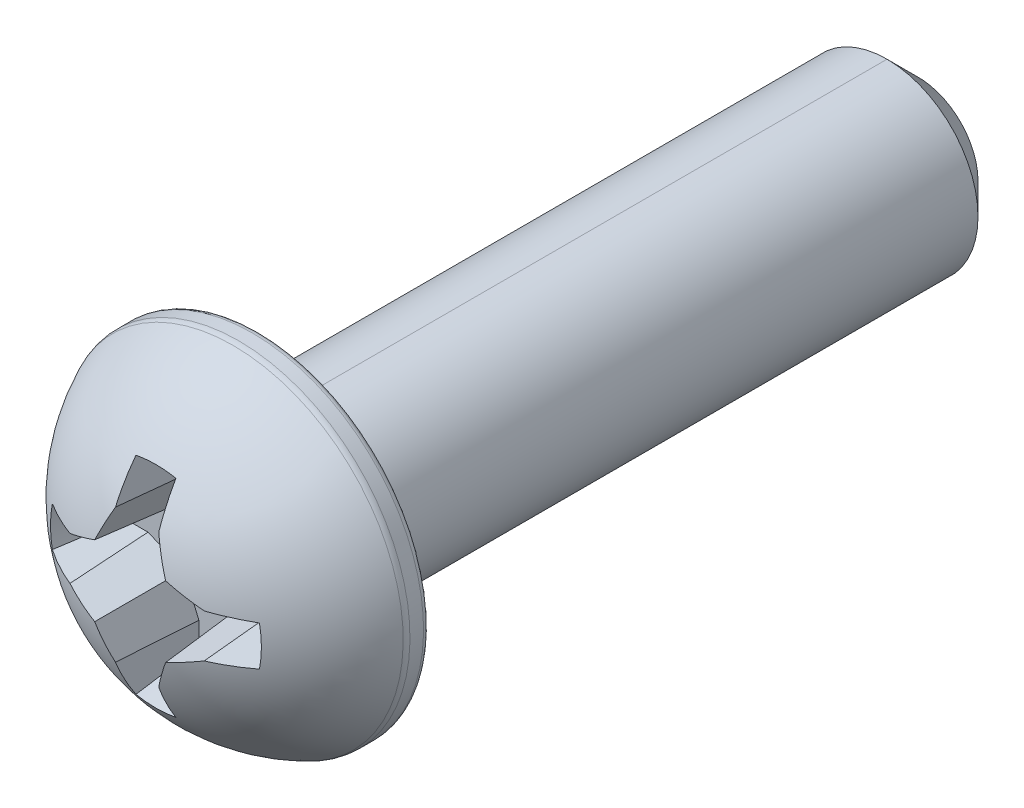
ISO-10303-21;
HEADER;
FILE_DESCRIPTION(('STEP AP214'),'2;1');
FILE_NAME('part.step','',(''),(''),'','','');
FILE_SCHEMA(('AUTOMOTIVE_DESIGN { 1 0 10303 214 1 1 1 1 }'));
ENDSEC;
DATA;
#1=APPLICATION_CONTEXT('core data for automotive mechanical design processes');
#2=APPLICATION_PROTOCOL_DEFINITION('international standard','automotive_design',2000,#1);
#3=PRODUCT_CONTEXT('',#1,'mechanical');
#4=PRODUCT('Part','Part','',(#3));
#5=PRODUCT_RELATED_PRODUCT_CATEGORY('part','',(#4));
#6=PRODUCT_DEFINITION_FORMATION('','',#4);
#7=PRODUCT_DEFINITION_CONTEXT('part definition',#1,'design');
#8=PRODUCT_DEFINITION('design','',#6,#7);
#9=PRODUCT_DEFINITION_SHAPE('','',#8);
#10=(LENGTH_UNIT() NAMED_UNIT(*) SI_UNIT(.MILLI.,.METRE.));
#11=(NAMED_UNIT(*) PLANE_ANGLE_UNIT() SI_UNIT($,.RADIAN.));
#12=(NAMED_UNIT(*) SI_UNIT($,.STERADIAN.) SOLID_ANGLE_UNIT());
#13=UNCERTAINTY_MEASURE_WITH_UNIT(LENGTH_MEASURE(1.E-05),#10,'distance_accuracy_value','');
#14=(GEOMETRIC_REPRESENTATION_CONTEXT(3) GLOBAL_UNCERTAINTY_ASSIGNED_CONTEXT((#13)) GLOBAL_UNIT_ASSIGNED_CONTEXT((#10,
#11,#12)) REPRESENTATION_CONTEXT('',''));
#15=CARTESIAN_POINT('',(0.,0.,0.));
#16=DIRECTION('',(0.,0.,1.));
#17=DIRECTION('',(1.,0.,0.));
#18=AXIS2_PLACEMENT_3D('',#15,#16,#17);
#19=CARTESIAN_POINT('',(0.,0.,0.));
#20=DIRECTION('',(0.,0.,1.));
#21=DIRECTION('',(1.,0.,0.));
#22=AXIS2_PLACEMENT_3D('',#19,#20,#21);
#23=PLANE('',#22);
#24=CARTESIAN_POINT('',(0.,0.,0.));
#25=DIRECTION('',(0.,0.,-1.));
#26=DIRECTION('',(0.,1.,0.));
#27=AXIS2_PLACEMENT_3D('',#24,#25,#26);
#28=CIRCLE('',#27,3.17119);
#29=CARTESIAN_POINT('',(0.,3.17119,0.));
#30=VERTEX_POINT('',#29);
#31=EDGE_CURVE('E446',#30,#30,#28,.T.);
#32=ORIENTED_EDGE('',*,*,#31,.T.);
#33=EDGE_LOOP('',(#32));
#34=FACE_BOUND('',#33,.T.);
#35=CARTESIAN_POINT('',(0.,0.,0.));
#36=DIRECTION('',(0.,0.,1.));
#37=DIRECTION('',(1.,0.,0.));
#38=AXIS2_PLACEMENT_3D('',#35,#36,#37);
#39=CIRCLE('',#38,1.75259999999999);
#40=CARTESIAN_POINT('',(0.,1.7526,0.));
#41=VERTEX_POINT('',#40);
#42=CARTESIAN_POINT('',(0.,-1.75259999999999,0.));
#43=VERTEX_POINT('',#42);
#44=EDGE_CURVE('E463',#41,#43,#39,.T.);
#45=ORIENTED_EDGE('',*,*,#44,.T.);
#46=EDGE_CURVE('E57',#43,#41,#39,.T.);
#47=ORIENTED_EDGE('',*,*,#46,.T.);
#48=EDGE_LOOP('',(#45,#47));
#49=FACE_BOUND('',#48,.T.);
#50=ADVANCED_FACE('F39',(#34,#49),#23,.F.);
#51=CARTESIAN_POINT('',(0.,0.,2.6162));
#52=DIRECTION('',(0.,0.,-1.));
#53=DIRECTION('',(-1.,0.,0.));
#54=AXIS2_PLACEMENT_3D('',#51,#52,#53);
#55=CYLINDRICAL_SURFACE('',#54,3.302);
#56=CARTESIAN_POINT('',(0.,0.,0.392429999999998));
#57=DIRECTION('',(0.,0.,-1.));
#58=DIRECTION('',(0.,1.,0.));
#59=AXIS2_PLACEMENT_3D('',#56,#57,#58);
#60=CIRCLE('',#59,3.302);
#61=CARTESIAN_POINT('',(0.,3.302,0.392429999999998));
#62=VERTEX_POINT('',#61);
#63=EDGE_CURVE('E434',#62,#62,#60,.T.);
#64=ORIENTED_EDGE('',*,*,#63,.T.);
#65=EDGE_LOOP('',(#64));
#66=FACE_BOUND('',#65,.T.);
#67=CARTESIAN_POINT('',(0.,0.,0.130809999999998));
#68=DIRECTION('',(0.,0.,-1.));
#69=DIRECTION('',(0.,1.,0.));
#70=AXIS2_PLACEMENT_3D('',#67,#68,#69);
#71=CIRCLE('',#70,3.302);
#72=CARTESIAN_POINT('',(0.,3.302,0.130809999999998));
#73=VERTEX_POINT('',#72);
#74=EDGE_CURVE('E432',#73,#73,#71,.T.);
#75=ORIENTED_EDGE('',*,*,#74,.F.);
#76=EDGE_LOOP('',(#75));
#77=FACE_BOUND('',#76,.T.);
#78=ADVANCED_FACE('F295',(#66,#77),#55,.T.);
#79=CARTESIAN_POINT('',(0.,0.,0.130809999999998));
#80=DIRECTION('',(0.,0.,-1.));
#81=DIRECTION('',(0.,1.,0.));
#82=AXIS2_PLACEMENT_3D('',#79,#80,#81);
#83=TOROIDAL_SURFACE('',#82,3.17119,0.13081);
#84=ORIENTED_EDGE('',*,*,#31,.F.);
#85=EDGE_LOOP('',(#84));
#86=FACE_BOUND('',#85,.T.);
#87=ORIENTED_EDGE('',*,*,#74,.T.);
#88=EDGE_LOOP('',(#87));
#89=FACE_BOUND('',#88,.T.);
#90=ADVANCED_FACE('F495',(#86,#89),#83,.T.);
#91=CARTESIAN_POINT('',(0.,0.,0.392429999999998));
#92=DIRECTION('',(0.,0.,-1.));
#93=DIRECTION('',(0.,1.,0.));
#94=AXIS2_PLACEMENT_3D('',#91,#92,#93);
#95=TOROIDAL_SURFACE('',#94,3.04038,0.261620000000001);
#96=ORIENTED_EDGE('',*,*,#63,.F.);
#97=EDGE_LOOP('',(#96));
#98=FACE_BOUND('',#97,.T.);
#99=CARTESIAN_POINT('',(0.,0.,0.50020092308562));
#100=DIRECTION('',(0.,0.,-1.));
#101=DIRECTION('',(0.,1.,0.));
#102=AXIS2_PLACEMENT_3D('',#99,#100,#101);
#103=CIRCLE('',#102,3.27877138519937);
#104=CARTESIAN_POINT('',(0.,3.27877138519937,0.50020092308562));
#105=VERTEX_POINT('',#104);
#106=EDGE_CURVE('E443',#105,#105,#103,.T.);
#107=ORIENTED_EDGE('',*,*,#106,.T.);
#108=EDGE_LOOP('',(#107));
#109=FACE_BOUND('',#108,.T.);
#110=ADVANCED_FACE('F486',(#98,#109),#95,.T.);
#111=CARTESIAN_POINT('',(0.,0.,-0.982051543689317));
#112=DIRECTION('',(0.,0.,-1.));
#113=DIRECTION('',(0.,1.,0.));
#114=AXIS2_PLACEMENT_3D('',#111,#112,#113);
#115=SPHERICAL_SURFACE('',#114,3.59825154368932);
#116=CARTESIAN_POINT('',(-0.124507435021984,0.,-0.992944532778432));
#117=DIRECTION('',(0.996194698091746,0.,0.0871557427476584));
#118=DIRECTION('',(0.0871557427476584,0.,-0.996194698091746));
#119=AXIS2_PLACEMENT_3D('',#116,#117,#118);
#120=CIRCLE('',#119,3.59608028457034);
#121=CARTESIAN_POINT('',(-0.41693491197537,1.2939210428619,2.34951682356323));
#122=VERTEX_POINT('',#121);
#123=CARTESIAN_POINT('',(-0.385220248810734,1.99590934126789,1.98701656482694));
#124=VERTEX_POINT('',#123);
#125=EDGE_CURVE('E11',#122,#124,#120,.F.);
#126=ORIENTED_EDGE('',*,*,#125,.T.);
#127=CARTESIAN_POINT('',(0.,0.,1.98701656482694));
#128=DIRECTION('',(0.,0.,-1.));
#129=DIRECTION('',(-1.,0.,0.));
#130=AXIS2_PLACEMENT_3D('',#127,#128,#129);
#131=CIRCLE('',#130,2.03274413998767);
#132=CARTESIAN_POINT('',(0.385220248810726,1.99590934126789,1.98701656482694));
#133=VERTEX_POINT('',#132);
#134=EDGE_CURVE('E425',#124,#133,#131,.T.);
#135=ORIENTED_EDGE('',*,*,#134,.T.);
#136=CARTESIAN_POINT('',(0.124507435021985,0.,-0.992944532778432));
#137=DIRECTION('',(-0.996194698091746,0.,0.0871557427476584));
#138=DIRECTION('',(0.0871557427476584,0.,0.996194698091746));
#139=AXIS2_PLACEMENT_3D('',#136,#137,#138);
#140=CIRCLE('',#139,3.59608028457034);
#141=CARTESIAN_POINT('',(0.416934911975365,1.29392104286191,2.34951682356323));
#142=VERTEX_POINT('',#141);
#143=EDGE_CURVE('E422',#133,#142,#140,.F.);
#144=ORIENTED_EDGE('',*,*,#143,.T.);
#145=CARTESIAN_POINT('',(0.539926348171825,0.223644816095348,-1.03318097446649));
#146=DIRECTION('',(-0.920363891963224,-0.381227206369654,0.0871557427476584));
#147=DIRECTION('',(0.38268343236509,-0.923879532511287,0.));
#148=AXIS2_PLACEMENT_3D('',#145,#146,#147);
#149=CIRCLE('',#148,3.55010739101713);
#150=CARTESIAN_POINT('',(0.682817061622561,0.682817061622561,2.48420521142517));
#151=VERTEX_POINT('',#150);
#152=EDGE_CURVE('E426',#142,#151,#149,.F.);
#153=ORIENTED_EDGE('',*,*,#152,.T.);
#154=CARTESIAN_POINT('',(0.223644816095348,0.539926348171825,-1.03318097446649));
#155=DIRECTION('',(-0.381227206369654,-0.920363891963224,0.0871557427476584));
#156=DIRECTION('',(0.923879532511287,-0.38268343236509,0.));
#157=AXIS2_PLACEMENT_3D('',#154,#155,#156);
#158=CIRCLE('',#157,3.55010739101713);
#159=CARTESIAN_POINT('',(1.29392104286191,0.416934911975365,2.34951682356323));
#160=VERTEX_POINT('',#159);
#161=EDGE_CURVE('E428',#151,#160,#158,.F.);
#162=ORIENTED_EDGE('',*,*,#161,.T.);
#163=CARTESIAN_POINT('',(0.,0.124507435021984,-0.992944532778432));
#164=DIRECTION('',(0.,-0.996194698091746,0.0871557427476584));
#165=DIRECTION('',(0.,-0.0871557427476584,-0.996194698091746));
#166=AXIS2_PLACEMENT_3D('',#163,#164,#165);
#167=CIRCLE('',#166,3.59608028457034);
#168=CARTESIAN_POINT('',(1.99590934126789,0.385220248810727,1.98701656482694));
#169=VERTEX_POINT('',#168);
#170=EDGE_CURVE('E329',#160,#169,#167,.F.);
#171=ORIENTED_EDGE('',*,*,#170,.T.);
#172=CARTESIAN_POINT('',(0.,0.,1.98701656482694));
#173=DIRECTION('',(0.,0.,-1.));
#174=DIRECTION('',(-1.,0.,0.));
#175=AXIS2_PLACEMENT_3D('',#172,#173,#174);
#176=CIRCLE('',#175,2.03274413998767);
#177=CARTESIAN_POINT('',(1.99590934126789,-0.385220248810705,1.98701656482694));
#178=VERTEX_POINT('',#177);
#179=EDGE_CURVE('E431',#169,#178,#176,.T.);
#180=ORIENTED_EDGE('',*,*,#179,.T.);
#181=CARTESIAN_POINT('',(0.,-0.124507435021986,-0.992944532778432));
#182=DIRECTION('',(0.,0.996194698091746,0.0871557427476584));
#183=DIRECTION('',(0.,-0.0871557427476584,0.996194698091746));
#184=AXIS2_PLACEMENT_3D('',#181,#182,#183);
#185=CIRCLE('',#184,3.59608028457034);
#186=CARTESIAN_POINT('',(1.29392104286191,-0.416934911975352,2.34951682356323));
#187=VERTEX_POINT('',#186);
#188=EDGE_CURVE('E206',#178,#187,#185,.F.);
#189=ORIENTED_EDGE('',*,*,#188,.T.);
#190=CARTESIAN_POINT('',(0.223644816095354,-0.539926348171823,-1.03318097446649));
#191=DIRECTION('',(-0.381227206369664,0.92036389196322,0.0871557427476584));
#192=DIRECTION('',(-0.923879532511283,-0.3826834323651,0.));
#193=AXIS2_PLACEMENT_3D('',#190,#191,#192);
#194=CIRCLE('',#193,3.55010739101713);
#195=CARTESIAN_POINT('',(0.682817061622568,-0.682817061622554,2.48420521142517));
#196=VERTEX_POINT('',#195);
#197=EDGE_CURVE('E402',#187,#196,#194,.F.);
#198=ORIENTED_EDGE('',*,*,#197,.T.);
#199=CARTESIAN_POINT('',(0.539926348171828,-0.223644816095342,-1.03318097446649));
#200=DIRECTION('',(-0.920363891963228,0.381227206369645,0.0871557427476584));
#201=DIRECTION('',(-0.382683432365081,-0.923879532511291,0.));
#202=AXIS2_PLACEMENT_3D('',#199,#200,#201);
#203=CIRCLE('',#202,3.55010739101713);
#204=CARTESIAN_POINT('',(0.416934911975379,-1.2939210428619,2.34951682356323));
#205=VERTEX_POINT('',#204);
#206=EDGE_CURVE('E563',#196,#205,#203,.F.);
#207=ORIENTED_EDGE('',*,*,#206,.T.);
#208=CARTESIAN_POINT('',(0.124507435021984,0.,-0.992944532778432));
#209=DIRECTION('',(-0.996194698091746,0.,0.0871557427476584));
#210=DIRECTION('',(0.0871557427476584,0.,0.996194698091746));
#211=AXIS2_PLACEMENT_3D('',#208,#209,#210);
#212=CIRCLE('',#211,3.59608028457034);
#213=CARTESIAN_POINT('',(0.385220248810748,-1.99590934126789,1.98701656482694));
#214=VERTEX_POINT('',#213);
#215=EDGE_CURVE('E227',#205,#214,#212,.F.);
#216=ORIENTED_EDGE('',*,*,#215,.T.);
#217=CARTESIAN_POINT('',(0.,0.,1.98701656482694));
#218=DIRECTION('',(0.,0.,-1.));
#219=DIRECTION('',(-1.,0.,0.));
#220=AXIS2_PLACEMENT_3D('',#217,#218,#219);
#221=CIRCLE('',#220,2.03274413998767);
#222=CARTESIAN_POINT('',(-0.385220248810712,-1.99590934126789,1.98701656482694));
#223=VERTEX_POINT('',#222);
#224=EDGE_CURVE('E398',#214,#223,#221,.T.);
#225=ORIENTED_EDGE('',*,*,#224,.T.);
#226=CARTESIAN_POINT('',(-0.124507435021985,0.,-0.992944532778432));
#227=DIRECTION('',(0.996194698091746,0.,0.0871557427476584));
#228=DIRECTION('',(0.0871557427476584,0.,-0.996194698091746));
#229=AXIS2_PLACEMENT_3D('',#226,#227,#228);
#230=CIRCLE('',#229,3.59608028457034);
#231=CARTESIAN_POINT('',(-0.416934911975356,-1.29392104286191,2.34951682356323));
#232=VERTEX_POINT('',#231);
#233=EDGE_CURVE('E260',#223,#232,#230,.F.);
#234=ORIENTED_EDGE('',*,*,#233,.T.);
#235=CARTESIAN_POINT('',(-0.539926348171824,-0.223644816095352,-1.03318097446649));
#236=DIRECTION('',(0.920363891963222,0.38122720636966,0.0871557427476584));
#237=DIRECTION('',(-0.382683432365097,0.923879532511284,0.));
#238=AXIS2_PLACEMENT_3D('',#235,#236,#237);
#239=CIRCLE('',#238,3.55010739101713);
#240=CARTESIAN_POINT('',(-0.682817061622556,-0.682817061622566,2.48420521142517));
#241=VERTEX_POINT('',#240);
#242=EDGE_CURVE('E396',#232,#241,#239,.F.);
#243=ORIENTED_EDGE('',*,*,#242,.T.);
#244=CARTESIAN_POINT('',(-0.223644816095345,-0.539926348171827,-1.03318097446649));
#245=DIRECTION('',(0.381227206369648,0.920363891963227,0.0871557427476584));
#246=DIRECTION('',(-0.923879532511289,0.382683432365084,0.));
#247=AXIS2_PLACEMENT_3D('',#244,#245,#246);
#248=CIRCLE('',#247,3.55010739101713);
#249=CARTESIAN_POINT('',(-1.2939210428619,-0.416934911975375,2.34951682356323));
#250=VERTEX_POINT('',#249);
#251=EDGE_CURVE('E385',#241,#250,#248,.F.);
#252=ORIENTED_EDGE('',*,*,#251,.T.);
#253=CARTESIAN_POINT('',(0.,-0.124507435021984,-0.992944532778432));
#254=DIRECTION('',(0.,0.996194698091746,0.0871557427476584));
#255=DIRECTION('',(0.,-0.0871557427476584,0.996194698091746));
#256=AXIS2_PLACEMENT_3D('',#253,#254,#255);
#257=CIRCLE('',#256,3.59608028457034);
#258=CARTESIAN_POINT('',(-1.99590934126789,-0.385220248810741,1.98701656482694));
#259=VERTEX_POINT('',#258);
#260=EDGE_CURVE('E286',#250,#259,#257,.F.);
#261=ORIENTED_EDGE('',*,*,#260,.T.);
#262=CARTESIAN_POINT('',(0.,0.,1.98701656482694));
#263=DIRECTION('',(0.,0.,-1.));
#264=DIRECTION('',(-1.,0.,0.));
#265=AXIS2_PLACEMENT_3D('',#262,#263,#264);
#266=CIRCLE('',#265,2.03274413998767);
#267=CARTESIAN_POINT('',(-1.99590934126789,0.385220248810719,1.98701656482694));
#268=VERTEX_POINT('',#267);
#269=EDGE_CURVE('E397',#259,#268,#266,.T.);
#270=ORIENTED_EDGE('',*,*,#269,.T.);
#271=CARTESIAN_POINT('',(0.,0.124507435021985,-0.992944532778432));
#272=DIRECTION('',(0.,-0.996194698091746,0.0871557427476584));
#273=DIRECTION('',(0.,-0.0871557427476584,-0.996194698091746));
#274=AXIS2_PLACEMENT_3D('',#271,#272,#273);
#275=CIRCLE('',#274,3.59608028457034);
#276=CARTESIAN_POINT('',(-1.29392104286191,0.416934911975361,2.34951682356323));
#277=VERTEX_POINT('',#276);
#278=EDGE_CURVE('E310',#268,#277,#275,.F.);
#279=ORIENTED_EDGE('',*,*,#278,.T.);
#280=CARTESIAN_POINT('',(-0.22364481609535,0.539926348171824,-1.03318097446649));
#281=DIRECTION('',(0.381227206369657,-0.920363891963223,0.0871557427476584));
#282=DIRECTION('',(0.923879532511285,0.382683432365093,0.));
#283=AXIS2_PLACEMENT_3D('',#280,#281,#282);
#284=CIRCLE('',#283,3.55010739101713);
#285=CARTESIAN_POINT('',(-0.682817061622563,0.682817061622558,2.48420521142517));
#286=VERTEX_POINT('',#285);
#287=EDGE_CURVE('E543',#277,#286,#284,.F.);
#288=ORIENTED_EDGE('',*,*,#287,.T.);
#289=CARTESIAN_POINT('',(-0.539926348171826,0.223644816095346,-1.03318097446649));
#290=DIRECTION('',(0.920363891963225,-0.381227206369651,0.0871557427476584));
#291=DIRECTION('',(0.382683432365087,0.923879532511288,0.));
#292=AXIS2_PLACEMENT_3D('',#289,#290,#291);
#293=CIRCLE('',#292,3.55010739101713);
#294=EDGE_CURVE('E49',#286,#122,#293,.F.);
#295=ORIENTED_EDGE('',*,*,#294,.T.);
#296=EDGE_LOOP('',(#126,#135,#144,#153,#162,#171,#180,#189,#198,#207,#216,#225,#234,#243,#252,
#261,#270,#279,#288,#295));
#297=FACE_BOUND('',#296,.T.);
#298=ORIENTED_EDGE('',*,*,#106,.F.);
#299=EDGE_LOOP('',(#298));
#300=FACE_BOUND('',#299,.T.);
#301=ADVANCED_FACE('F392',(#297,#300),#115,.T.);
#302=CARTESIAN_POINT('',(0.,0.,0.));
#303=DIRECTION('',(0.,0.,1.));
#304=DIRECTION('',(1.,0.,0.));
#305=AXIS2_PLACEMENT_3D('',#302,#303,#304);
#306=CYLINDRICAL_SURFACE('',#305,1.7526);
#307=DIRECTION('',(0.,0.,1.));
#308=VECTOR('',#307,1.);
#309=CARTESIAN_POINT('',(0.,1.7526,0.));
#310=LINE('',#309,#308);
#311=CARTESIAN_POINT('',(0.,1.7526,-12.1046875));
#312=VERTEX_POINT('',#311);
#313=EDGE_CURVE('E449',#312,#41,#310,.T.);
#314=ORIENTED_EDGE('',*,*,#313,.F.);
#315=CARTESIAN_POINT('',(0.,0.,-12.1046875));
#316=DIRECTION('',(0.,0.,1.));
#317=DIRECTION('',(1.,0.,0.));
#318=AXIS2_PLACEMENT_3D('',#315,#316,#317);
#319=CIRCLE('',#318,1.7526);
#320=CARTESIAN_POINT('',(0.,-1.7526,-12.1046875));
#321=VERTEX_POINT('',#320);
#322=EDGE_CURVE('E459',#312,#321,#319,.T.);
#323=ORIENTED_EDGE('',*,*,#322,.T.);
#324=DIRECTION('',(0.,0.,1.));
#325=VECTOR('',#324,1.);
#326=CARTESIAN_POINT('',(0.,-1.7526,0.));
#327=LINE('',#326,#325);
#328=EDGE_CURVE('E450',#43,#321,#327,.F.);
#329=ORIENTED_EDGE('',*,*,#328,.F.);
#330=ORIENTED_EDGE('',*,*,#44,.F.);
#331=EDGE_LOOP('',(#314,#323,#329,#330));
#332=FACE_BOUND('',#331,.T.);
#333=ADVANCED_FACE('F476',(#332),#306,.T.);
#334=CARTESIAN_POINT('',(0.,0.,-12.7));
#335=DIRECTION('',(0.,0.,1.));
#336=DIRECTION('',(1.,0.,0.));
#337=AXIS2_PLACEMENT_3D('',#334,#335,#336);
#338=PLANE('',#337);
#339=CARTESIAN_POINT('',(0.,0.,-12.7));
#340=DIRECTION('',(0.,0.,1.));
#341=DIRECTION('',(1.,0.,0.));
#342=AXIS2_PLACEMENT_3D('',#339,#340,#341);
#343=CIRCLE('',#342,1.1572875);
#344=CARTESIAN_POINT('',(1.1572875,0.,-12.7));
#345=VERTEX_POINT('',#344);
#346=EDGE_CURVE('E454',#345,#345,#343,.F.);
#347=ORIENTED_EDGE('',*,*,#346,.T.);
#348=EDGE_LOOP('',(#347));
#349=FACE_BOUND('',#348,.T.);
#350=ADVANCED_FACE('F478',(#349),#338,.F.);
#351=EDGE_CURVE('E462',#321,#312,#319,.T.);
#352=ORIENTED_EDGE('',*,*,#351,.T.);
#353=ORIENTED_EDGE('',*,*,#313,.T.);
#354=ORIENTED_EDGE('',*,*,#46,.F.);
#355=ORIENTED_EDGE('',*,*,#328,.T.);
#356=EDGE_LOOP('',(#352,#353,#354,#355));
#357=FACE_BOUND('',#356,.T.);
#358=ADVANCED_FACE('F470',(#357),#306,.T.);
#359=CARTESIAN_POINT('',(0.,0.,-12.1046875));
#360=DIRECTION('',(0.,0.,1.));
#361=DIRECTION('',(1.,0.,0.));
#362=AXIS2_PLACEMENT_3D('',#359,#360,#361);
#363=CONICAL_SURFACE('',#362,1.7526,0.785398163397449);
#364=ORIENTED_EDGE('',*,*,#346,.F.);
#365=EDGE_LOOP('',(#364));
#366=FACE_BOUND('',#365,.T.);
#367=ORIENTED_EDGE('',*,*,#322,.F.);
#368=ORIENTED_EDGE('',*,*,#351,.F.);
#369=EDGE_LOOP('',(#367,#368));
#370=FACE_BOUND('',#369,.T.);
#371=ADVANCED_FACE('F474',(#366,#370),#363,.T.);
#372=CARTESIAN_POINT('',(0.,0.,2.6162));
#373=DIRECTION('',(0.,0.,1.));
#374=DIRECTION('',(1.,0.,0.));
#375=AXIS2_PLACEMENT_3D('',#372,#373,#374);
#376=CONICAL_SURFACE('',#375,2.20133333333333,0.26179938779915);
#377=ORIENTED_EDGE('',*,*,#134,.F.);
#378=CARTESIAN_POINT('',(-0.385220248810734,1.99590934126789,1.98701656482694));
#379=CARTESIAN_POINT('',(-0.362491254417169,1.9293962326043,1.72722297011933));
#380=CARTESIAN_POINT('',(-0.339763579024146,1.86282367105337,1.4674444516569));
#381=CARTESIAN_POINT('',(-0.294312374712388,1.729493746727,0.947934809150019));
#382=CARTESIAN_POINT('',(-0.271588845788918,1.66273638416397,0.688203685051456));
#383=CARTESIAN_POINT('',(-0.226147372547861,1.52897075652831,0.168805269191654));
#384=CARTESIAN_POINT('',(-0.203429428234738,1.46196249125582,-0.0908620225185583));
#385=CARTESIAN_POINT('',(-0.158002449216702,1.32754843458989,-0.610094768651151));
#386=CARTESIAN_POINT('',(-0.135293414522388,1.26014264272503,-0.869660222952369));
#387=CARTESIAN_POINT('',(-0.112590515035768,1.19246482853519,-1.12915555150877));
#388=B_SPLINE_CURVE_WITH_KNOTS('',3,(#378,#379,#380,#381,#382,#383,#384,#385,#386,#387),
.UNSPECIFIED.,.F.,.F.,(4,2,2,2,4),(0.,0.807403156879685,1.61480538604857,2.4222082585354,
3.22961208873812),.UNSPECIFIED.);
#389=CARTESIAN_POINT('',(-0.287674772322325,1.7099646673624,0.872066666666668));
#390=VERTEX_POINT('',#389);
#391=EDGE_CURVE('E348',#390,#124,#388,.F.);
#392=ORIENTED_EDGE('',*,*,#391,.F.);
#393=CARTESIAN_POINT('',(0.,0.,0.872066666666668));
#394=DIRECTION('',(0.,0.,1.));
#395=DIRECTION('',(1.,0.,0.));
#396=AXIS2_PLACEMENT_3D('',#393,#394,#395);
#397=CIRCLE('',#396,1.73399421517446);
#398=CARTESIAN_POINT('',(0.287674772322318,1.7099646673624,0.872066666666668));
#399=VERTEX_POINT('',#398);
#400=EDGE_CURVE('E328',#399,#390,#397,.T.);
#401=ORIENTED_EDGE('',*,*,#400,.F.);
#402=CARTESIAN_POINT('',(0.137106832769136,1.26544795871379,-0.848932757545206));
#403=CARTESIAN_POINT('',(0.165544737014762,1.3499410742672,-0.523886024636789));
#404=CARTESIAN_POINT('',(0.193990385214494,1.43408967412497,-0.198750777927902));
#405=CARTESIAN_POINT('',(0.250892577935232,1.60189959466722,0.451644261011941));
#406=CARTESIAN_POINT('',(0.279349122447519,1.68556091574075,0.776904053143237));
#407=CARTESIAN_POINT('',(0.317446316909431,1.79736192198069,1.21235697843135));
#408=CARTESIAN_POINT('',(0.327084155875837,1.82562793990584,1.32251798190297));
#409=CARTESIAN_POINT('',(0.370003143824102,1.95143204150943,1.81308425893322));
#410=CARTESIAN_POINT('',(0.403287853072646,2.0488102392971,2.19353022652628));
#411=CARTESIAN_POINT('',(0.469862458338386,2.24333250173851,2.95448144674938));
#412=CARTESIAN_POINT('',(0.503152354353987,2.34047656646409,3.33498669936118));
#413=CARTESIAN_POINT('',(0.536443561155552,2.43756105084667,3.71550693432512));
#414=B_SPLINE_CURVE_WITH_KNOTS('',3,(#402,#403,#404,#405,#406,#407,#408,#409,#410,#411,#412,
#413),.UNSPECIFIED.,.F.,.F.,(4,2,2,2,2,4),(0.,1.01115145506021,2.02230210268686,
2.36471373187784,3.54706960181812,4.72942510891552),.UNSPECIFIED.);
#415=EDGE_CURVE('E411',#399,#133,#414,.T.);
#416=ORIENTED_EDGE('',*,*,#415,.T.);
#417=EDGE_LOOP('',(#377,#392,#401,#416));
#418=FACE_BOUND('',#417,.T.);
#419=ADVANCED_FACE('F297',(#418),#376,.F.);
#420=CARTESIAN_POINT('',(0.440266666666667,0.,2.6162));
#421=DIRECTION('',(-0.996194698091746,0.,0.0871557427476584));
#422=DIRECTION('',(0.0871557427476584,0.,0.996194698091746));
#423=AXIS2_PLACEMENT_3D('',#420,#421,#422);
#424=PLANE('',#423);
#425=ORIENTED_EDGE('',*,*,#415,.F.);
#426=DIRECTION('',(0.,-1.,0.));
#427=VECTOR('',#426,1.);
#428=CARTESIAN_POINT('',(0.287674772322318,0.,0.872066666666668));
#429=LINE('',#428,#427);
#430=CARTESIAN_POINT('',(0.287674772322318,1.26820960247569,0.872066666666668));
#431=VERTEX_POINT('',#430);
#432=EDGE_CURVE('E338',#431,#399,#429,.F.);
#433=ORIENTED_EDGE('',*,*,#432,.F.);
#434=DIRECTION('',(0.0871426484044397,0.0173337504938603,0.996045029063886));
#435=VECTOR('',#434,1.);
#436=CARTESIAN_POINT('',(0.438305177149922,1.29817185289931,2.59378007223229));
#437=LINE('',#436,#435);
#438=EDGE_CURVE('E408',#431,#142,#437,.T.);
#439=ORIENTED_EDGE('',*,*,#438,.T.);
#440=ORIENTED_EDGE('',*,*,#143,.F.);
#441=EDGE_LOOP('',(#425,#433,#439,#440));
#442=FACE_BOUND('',#441,.T.);
#443=ADVANCED_FACE('F243',(#442),#424,.T.);
#444=CARTESIAN_POINT('',(0.83490211025396,0.345827777321108,2.6162));
#445=DIRECTION('',(-0.920363891963224,-0.381227206369654,0.0871557427476584));
#446=DIRECTION('',(0.38268343236509,-0.923879532511287,0.));
#447=AXIS2_PLACEMENT_3D('',#444,#445,#446);
#448=PLANE('',#447);
#449=ORIENTED_EDGE('',*,*,#438,.F.);
#450=DIRECTION('',(0.38268343236509,-0.923879532511287,0.));
#451=VECTOR('',#450,1.);
#452=CARTESIAN_POINT('',(0.693925582242092,0.287433387442322,0.872066666666668));
#453=LINE('',#452,#451);
#454=CARTESIAN_POINT('',(0.574866774884642,0.574866774884642,0.872066666666668));
#455=VERTEX_POINT('',#454);
#456=EDGE_CURVE('E335',#455,#431,#453,.F.);
#457=ORIENTED_EDGE('',*,*,#456,.F.);
#458=DIRECTION('',(0.0666626913468324,0.0666626913468323,0.995546167269401));
#459=VECTOR('',#458,1.);
#460=CARTESIAN_POINT('',(0.690755301030325,0.690755301030325,2.60275553781613));
#461=LINE('',#460,#459);
#462=EDGE_CURVE('E412',#455,#151,#461,.T.);
#463=ORIENTED_EDGE('',*,*,#462,.T.);
#464=ORIENTED_EDGE('',*,*,#152,.F.);
#465=EDGE_LOOP('',(#449,#457,#463,#464));
#466=FACE_BOUND('',#465,.T.);
#467=ADVANCED_FACE('F514',(#466),#448,.T.);
#468=CARTESIAN_POINT('',(0.345827777321108,0.83490211025396,2.6162));
#469=DIRECTION('',(-0.381227206369654,-0.920363891963224,0.0871557427476584));
#470=DIRECTION('',(0.923879532511287,-0.38268343236509,0.));
#471=AXIS2_PLACEMENT_3D('',#468,#469,#470);
#472=PLANE('',#471);
#473=ORIENTED_EDGE('',*,*,#462,.F.);
#474=DIRECTION('',(0.923879532511287,-0.38268343236509,0.));
#475=VECTOR('',#474,1.);
#476=CARTESIAN_POINT('',(0.287433387442321,0.693925582242092,0.872066666666668));
#477=LINE('',#476,#475);
#478=CARTESIAN_POINT('',(1.26820960247569,0.287674772322318,0.872066666666668));
#479=VERTEX_POINT('',#478);
#480=EDGE_CURVE('E332',#479,#455,#477,.F.);
#481=ORIENTED_EDGE('',*,*,#480,.F.);
#482=DIRECTION('',(0.0173337504938603,0.0871426484044397,0.996045029063886));
#483=VECTOR('',#482,1.);
#484=CARTESIAN_POINT('',(1.2988718602946,0.44182435197304,2.63400442452309));
#485=LINE('',#484,#483);
#486=EDGE_CURVE('E327',#479,#160,#485,.T.);
#487=ORIENTED_EDGE('',*,*,#486,.T.);
#488=ORIENTED_EDGE('',*,*,#161,.F.);
#489=EDGE_LOOP('',(#473,#481,#487,#488));
#490=FACE_BOUND('',#489,.T.);
#491=ADVANCED_FACE('F319',(#490),#472,.T.);
#492=CARTESIAN_POINT('',(0.,0.440266666666665,2.6162));
#493=DIRECTION('',(0.,-0.996194698091746,0.0871557427476584));
#494=DIRECTION('',(0.,-0.0871557427476584,-0.996194698091746));
#495=AXIS2_PLACEMENT_3D('',#492,#493,#494);
#496=PLANE('',#495);
#497=ORIENTED_EDGE('',*,*,#486,.F.);
#498=DIRECTION('',(1.,0.,0.));
#499=VECTOR('',#498,1.);
#500=CARTESIAN_POINT('',(0.,0.287674772322316,0.872066666666668));
#501=LINE('',#500,#499);
#502=CARTESIAN_POINT('',(1.7099646673624,0.287674772322318,0.872066666666668));
#503=VERTEX_POINT('',#502);
#504=EDGE_CURVE('E198',#503,#479,#501,.F.);
#505=ORIENTED_EDGE('',*,*,#504,.F.);
#506=CARTESIAN_POINT('',(1.99590934126789,0.385220248810727,1.98701656482694));
#507=CARTESIAN_POINT('',(1.9293962326043,0.362491254417162,1.72722297011933));
#508=CARTESIAN_POINT('',(1.86282367105337,0.339763579024139,1.4674444516569));
#509=CARTESIAN_POINT('',(1.729493746727,0.294312374712381,0.947934809150019));
#510=CARTESIAN_POINT('',(1.66273638416397,0.271588845788912,0.688203685051456));
#511=CARTESIAN_POINT('',(1.52897075652832,0.226147372547856,0.168805269191655));
#512=CARTESIAN_POINT('',(1.46196249125582,0.203429428234733,-0.090862022518558));
#513=CARTESIAN_POINT('',(1.32754843458989,0.158002449216696,-0.61009476865115));
#514=CARTESIAN_POINT('',(1.26014264272503,0.135293414522383,-0.869660222952369));
#515=CARTESIAN_POINT('',(1.19246482853519,0.112590515035763,-1.12915555150877));
#516=B_SPLINE_CURVE_WITH_KNOTS('',3,(#506,#507,#508,#509,#510,#511,#512,#513,#514,#515),
.UNSPECIFIED.,.F.,.F.,(4,2,2,2,4),(0.,0.807403156879685,1.61480538604857,2.4222082585354,
3.22961208873812),.UNSPECIFIED.);
#517=EDGE_CURVE('E193',#503,#169,#516,.F.);
#518=ORIENTED_EDGE('',*,*,#517,.T.);
#519=ORIENTED_EDGE('',*,*,#170,.F.);
#520=EDGE_LOOP('',(#497,#505,#518,#519));
#521=FACE_BOUND('',#520,.T.);
#522=ADVANCED_FACE('F316',(#521),#496,.T.);
#523=CARTESIAN_POINT('',(0.,0.,2.6162));
#524=DIRECTION('',(0.,0.,1.));
#525=DIRECTION('',(1.,0.,0.));
#526=AXIS2_PLACEMENT_3D('',#523,#524,#525);
#527=CONICAL_SURFACE('',#526,2.20133333333333,0.26179938779915);
#528=ORIENTED_EDGE('',*,*,#517,.F.);
#529=CARTESIAN_POINT('',(0.,0.,0.872066666666668));
#530=DIRECTION('',(0.,0.,1.));
#531=DIRECTION('',(1.,0.,0.));
#532=AXIS2_PLACEMENT_3D('',#529,#530,#531);
#533=CIRCLE('',#532,1.73399421517446);
#534=CARTESIAN_POINT('',(1.7099646673624,-0.2876747723223,0.872066666666668));
#535=VERTEX_POINT('',#534);
#536=EDGE_CURVE('E188',#535,#503,#533,.T.);
#537=ORIENTED_EDGE('',*,*,#536,.F.);
#538=CARTESIAN_POINT('',(1.26544795871379,-0.137106832769123,-0.848932757545209));
#539=CARTESIAN_POINT('',(1.3499410742672,-0.165544737014748,-0.523886024636789));
#540=CARTESIAN_POINT('',(1.43408967412498,-0.193990385214479,-0.1987507779279));
#541=CARTESIAN_POINT('',(1.60189959466722,-0.250892577935216,0.451644261011942));
#542=CARTESIAN_POINT('',(1.68556091574075,-0.279349122447502,0.776904053143236));
#543=CARTESIAN_POINT('',(1.79736192198069,-0.317446316909412,1.21235697843135));
#544=CARTESIAN_POINT('',(1.82562793990584,-0.327084155875818,1.32251798190297));
#545=CARTESIAN_POINT('',(1.95143204150943,-0.370003143824082,1.81308425893322));
#546=CARTESIAN_POINT('',(2.04881023929711,-0.403287853072625,2.19353022652629));
#547=CARTESIAN_POINT('',(2.24333250173852,-0.469862458338363,2.95448144674939));
#548=CARTESIAN_POINT('',(2.3404765664641,-0.503152354353963,3.33498669936118));
#549=CARTESIAN_POINT('',(2.43756105084668,-0.536443561155527,3.71550693432512));
#550=B_SPLINE_CURVE_WITH_KNOTS('',3,(#538,#539,#540,#541,#542,#543,#544,#545,#546,#547,#548,
#549),.UNSPECIFIED.,.F.,.F.,(4,2,2,2,2,4),(0.,1.01115145506022,2.02230210268686,
2.36471373187785,3.54706960181813,4.72942510891552),.UNSPECIFIED.);
#551=EDGE_CURVE('E191',#535,#178,#550,.T.);
#552=ORIENTED_EDGE('',*,*,#551,.T.);
#553=ORIENTED_EDGE('',*,*,#179,.F.);
#554=EDGE_LOOP('',(#528,#537,#552,#553));
#555=FACE_BOUND('',#554,.T.);
#556=ADVANCED_FACE('F190',(#555),#527,.F.);
#557=CARTESIAN_POINT('',(0.,0.,0.872066666666668));
#558=DIRECTION('',(0.,0.,1.));
#559=DIRECTION('',(1.,0.,0.));
#560=AXIS2_PLACEMENT_3D('',#557,#558,#559);
#561=PLANE('',#560);
#562=ORIENTED_EDGE('',*,*,#400,.T.);
#563=DIRECTION('',(0.,1.,0.));
#564=VECTOR('',#563,1.);
#565=CARTESIAN_POINT('',(-0.287674772322317,0.,0.872066666666668));
#566=LINE('',#565,#564);
#567=CARTESIAN_POINT('',(-0.287674772322323,1.26820960247569,0.872066666666668));
#568=VERTEX_POINT('',#567);
#569=EDGE_CURVE('E256',#390,#568,#566,.F.);
#570=ORIENTED_EDGE('',*,*,#569,.T.);
#571=DIRECTION('',(0.382683432365087,0.923879532511288,0.));
#572=VECTOR('',#571,1.);
#573=CARTESIAN_POINT('',(-0.693925582242093,0.28743338744232,0.872066666666668));
#574=LINE('',#573,#572);
#575=CARTESIAN_POINT('',(-0.574866774884644,0.57486677488464,0.872066666666668));
#576=VERTEX_POINT('',#575);
#577=EDGE_CURVE('E367',#568,#576,#574,.F.);
#578=ORIENTED_EDGE('',*,*,#577,.T.);
#579=DIRECTION('',(0.923879532511285,0.382683432365093,0.));
#580=VECTOR('',#579,1.);
#581=CARTESIAN_POINT('',(-0.287433387442324,0.693925582242091,0.872066666666668));
#582=LINE('',#581,#580);
#583=CARTESIAN_POINT('',(-1.26820960247569,0.287674772322313,0.872066666666668));
#584=VERTEX_POINT('',#583);
#585=EDGE_CURVE('E370',#576,#584,#582,.F.);
#586=ORIENTED_EDGE('',*,*,#585,.T.);
#587=DIRECTION('',(1.,0.,0.));
#588=VECTOR('',#587,1.);
#589=CARTESIAN_POINT('',(0.,0.287674772322318,0.872066666666668));
#590=LINE('',#589,#588);
#591=CARTESIAN_POINT('',(-1.7099646673624,0.287674772322312,0.872066666666668));
#592=VERTEX_POINT('',#591);
#593=EDGE_CURVE('E358',#584,#592,#590,.F.);
#594=ORIENTED_EDGE('',*,*,#593,.T.);
#595=CARTESIAN_POINT('',(0.,0.,0.872066666666668));
#596=DIRECTION('',(0.,0.,1.));
#597=DIRECTION('',(1.,0.,0.));
#598=AXIS2_PLACEMENT_3D('',#595,#596,#597);
#599=CIRCLE('',#598,1.73399421517446);
#600=CARTESIAN_POINT('',(-1.7099646673624,-0.287674772322331,0.872066666666668));
#601=VERTEX_POINT('',#600);
#602=EDGE_CURVE('E353',#592,#601,#599,.T.);
#603=ORIENTED_EDGE('',*,*,#602,.T.);
#604=DIRECTION('',(-1.,0.,0.));
#605=VECTOR('',#604,1.);
#606=CARTESIAN_POINT('',(0.,-0.287674772322317,0.872066666666668));
#607=LINE('',#606,#605);
#608=CARTESIAN_POINT('',(-1.26820960247569,-0.287674772322327,0.872066666666668));
#609=VERTEX_POINT('',#608);
#610=EDGE_CURVE('E207',#601,#609,#607,.F.);
#611=ORIENTED_EDGE('',*,*,#610,.T.);
#612=DIRECTION('',(-0.923879532511289,0.382683432365084,0.));
#613=VECTOR('',#612,1.);
#614=CARTESIAN_POINT('',(-0.287433387442317,-0.693925582242095,0.872066666666668));
#615=LINE('',#614,#613);
#616=CARTESIAN_POINT('',(-0.574866774884638,-0.574866774884647,0.872066666666668));
#617=VERTEX_POINT('',#616);
#618=EDGE_CURVE('E387',#609,#617,#615,.F.);
#619=ORIENTED_EDGE('',*,*,#618,.T.);
#620=DIRECTION('',(-0.382683432365097,0.923879532511284,0.));
#621=VECTOR('',#620,1.);
#622=CARTESIAN_POINT('',(-0.69392558224209,-0.287433387442326,0.872066666666668));
#623=LINE('',#622,#621);
#624=CARTESIAN_POINT('',(-0.287674772322309,-1.2682096024757,0.872066666666668));
#625=VERTEX_POINT('',#624);
#626=EDGE_CURVE('E547',#617,#625,#623,.F.);
#627=ORIENTED_EDGE('',*,*,#626,.T.);
#628=DIRECTION('',(0.,1.,0.));
#629=VECTOR('',#628,1.);
#630=CARTESIAN_POINT('',(-0.287674772322318,0.,0.872066666666668));
#631=LINE('',#630,#629);
#632=CARTESIAN_POINT('',(-0.287674772322306,-1.7099646673624,0.872066666666668));
#633=VERTEX_POINT('',#632);
#634=EDGE_CURVE('E407',#625,#633,#631,.F.);
#635=ORIENTED_EDGE('',*,*,#634,.T.);
#636=CARTESIAN_POINT('',(0.,0.,0.872066666666668));
#637=DIRECTION('',(0.,0.,1.));
#638=DIRECTION('',(1.,0.,0.));
#639=AXIS2_PLACEMENT_3D('',#636,#637,#638);
#640=CIRCLE('',#639,1.73399421517446);
#641=CARTESIAN_POINT('',(0.287674772322337,-1.7099646673624,0.872066666666668));
#642=VERTEX_POINT('',#641);
#643=EDGE_CURVE('E285',#633,#642,#640,.T.);
#644=ORIENTED_EDGE('',*,*,#643,.T.);
#645=DIRECTION('',(0.,-1.,0.));
#646=VECTOR('',#645,1.);
#647=CARTESIAN_POINT('',(0.287674772322317,0.,0.872066666666668));
#648=LINE('',#647,#646);
#649=CARTESIAN_POINT('',(0.287674772322331,-1.26820960247569,0.872066666666668));
#650=VERTEX_POINT('',#649);
#651=EDGE_CURVE('E217',#642,#650,#648,.F.);
#652=ORIENTED_EDGE('',*,*,#651,.T.);
#653=DIRECTION('',(-0.382683432365081,-0.923879532511291,0.));
#654=VECTOR('',#653,1.);
#655=CARTESIAN_POINT('',(0.693925582242096,-0.287433387442314,0.872066666666668));
#656=LINE('',#655,#654);
#657=CARTESIAN_POINT('',(0.574866774884648,-0.574866774884637,0.872066666666668));
#658=VERTEX_POINT('',#657);
#659=EDGE_CURVE('E216',#650,#658,#656,.F.);
#660=ORIENTED_EDGE('',*,*,#659,.T.);
#661=DIRECTION('',(-0.923879532511283,-0.3826834323651,0.));
#662=VECTOR('',#661,1.);
#663=CARTESIAN_POINT('',(0.287433387442329,-0.693925582242089,0.872066666666668));
#664=LINE('',#663,#662);
#665=CARTESIAN_POINT('',(1.2682096024757,-0.287674772322305,0.872066666666668));
#666=VERTEX_POINT('',#665);
#667=EDGE_CURVE('E211',#658,#666,#664,.F.);
#668=ORIENTED_EDGE('',*,*,#667,.T.);
#669=DIRECTION('',(-1.,0.,0.));
#670=VECTOR('',#669,1.);
#671=CARTESIAN_POINT('',(0.,-0.287674772322318,0.872066666666668));
#672=LINE('',#671,#670);
#673=EDGE_CURVE('E43',#666,#535,#672,.F.);
#674=ORIENTED_EDGE('',*,*,#673,.T.);
#675=ORIENTED_EDGE('',*,*,#536,.T.);
#676=ORIENTED_EDGE('',*,*,#504,.T.);
#677=ORIENTED_EDGE('',*,*,#480,.T.);
#678=ORIENTED_EDGE('',*,*,#456,.T.);
#679=ORIENTED_EDGE('',*,*,#432,.T.);
#680=EDGE_LOOP('',(#562,#570,#578,#586,#594,#603,#611,#619,#627,#635,#644,#652,#660,#668,#674,
#675,#676,#677,#678,#679));
#681=FACE_BOUND('',#680,.T.);
#682=ADVANCED_FACE('F209',(#681),#561,.T.);
#683=CARTESIAN_POINT('',(0.,0.,2.6162));
#684=DIRECTION('',(0.,0.,1.));
#685=DIRECTION('',(1.,0.,0.));
#686=AXIS2_PLACEMENT_3D('',#683,#684,#685);
#687=CONICAL_SURFACE('',#686,2.20133333333333,0.26179938779915);
#688=CARTESIAN_POINT('',(-1.99590934126789,-0.385220248810741,1.98701656482694));
#689=CARTESIAN_POINT('',(-1.9293962326043,-0.362491254417176,1.72722297011933));
#690=CARTESIAN_POINT('',(-1.86282367105337,-0.339763579024153,1.4674444516569));
#691=CARTESIAN_POINT('',(-1.729493746727,-0.294312374712394,0.947934809150019));
#692=CARTESIAN_POINT('',(-1.66273638416397,-0.271588845788924,0.688203685051455));
#693=CARTESIAN_POINT('',(-1.52897075652831,-0.226147372547867,0.168805269191654));
#694=CARTESIAN_POINT('',(-1.46196249125582,-0.203429428234743,-0.0908620225185582));
#695=CARTESIAN_POINT('',(-1.32754843458989,-0.158002449216706,-0.610094768651151));
#696=CARTESIAN_POINT('',(-1.26014264272503,-0.135293414522393,-0.869660222952369));
#697=CARTESIAN_POINT('',(-1.19246482853519,-0.112590515035772,-1.12915555150877));
#698=B_SPLINE_CURVE_WITH_KNOTS('',3,(#688,#689,#690,#691,#692,#693,#694,#695,#696,#697),
.UNSPECIFIED.,.F.,.F.,(4,2,2,2,4),(0.,0.807403156879685,1.61480538604857,2.4222082585354,
3.22961208873812),.UNSPECIFIED.);
#699=EDGE_CURVE('E277',#601,#259,#698,.F.);
#700=ORIENTED_EDGE('',*,*,#699,.F.);
#701=ORIENTED_EDGE('',*,*,#602,.F.);
#702=CARTESIAN_POINT('',(-1.26544795871379,0.137106832769131,-0.848932757545207));
#703=CARTESIAN_POINT('',(-1.3499410742672,0.165544737014757,-0.52388602463679));
#704=CARTESIAN_POINT('',(-1.43408967412497,0.193990385214488,-0.198750777927903));
#705=CARTESIAN_POINT('',(-1.60189959466722,0.250892577935226,0.45164426101194));
#706=CARTESIAN_POINT('',(-1.68556091574075,0.279349122447513,0.776904053143236));
#707=CARTESIAN_POINT('',(-1.79736192198069,0.317446316909424,1.21235697843135));
#708=CARTESIAN_POINT('',(-1.82562793990584,0.32708415587583,1.32251798190297));
#709=CARTESIAN_POINT('',(-1.95143204150943,0.370003143824095,1.81308425893322));
#710=CARTESIAN_POINT('',(-2.0488102392971,0.403287853072639,2.19353022652628));
#711=CARTESIAN_POINT('',(-2.24333250173851,0.469862458338378,2.95448144674938));
#712=CARTESIAN_POINT('',(-2.34047656646409,0.503152354353978,3.33498669936118));
#713=CARTESIAN_POINT('',(-2.43756105084667,0.536443561155543,3.71550693432512));
#714=B_SPLINE_CURVE_WITH_KNOTS('',3,(#702,#703,#704,#705,#706,#707,#708,#709,#710,#711,#712,
#713),.UNSPECIFIED.,.F.,.F.,(4,2,2,2,2,4),(0.,1.01115145506021,2.02230210268686,
2.36471373187785,3.54706960181812,4.72942510891552),.UNSPECIFIED.);
#715=EDGE_CURVE('E199',#592,#268,#714,.T.);
#716=ORIENTED_EDGE('',*,*,#715,.T.);
#717=ORIENTED_EDGE('',*,*,#269,.F.);
#718=EDGE_LOOP('',(#700,#701,#716,#717));
#719=FACE_BOUND('',#718,.T.);
#720=ADVANCED_FACE('F289',(#719),#687,.F.);
#721=CARTESIAN_POINT('',(0.,0.440266666666666,2.6162));
#722=DIRECTION('',(0.,-0.996194698091746,0.0871557427476584));
#723=DIRECTION('',(0.,-0.0871557427476584,-0.996194698091746));
#724=AXIS2_PLACEMENT_3D('',#721,#722,#723);
#725=PLANE('',#724);
#726=ORIENTED_EDGE('',*,*,#715,.F.);
#727=ORIENTED_EDGE('',*,*,#593,.F.);
#728=DIRECTION('',(-0.0173337504938606,0.0871426484044396,0.996045029063886));
#729=VECTOR('',#728,1.);
#730=CARTESIAN_POINT('',(-1.29817185289931,0.438305177149917,2.59378007223229));
#731=LINE('',#730,#729);
#732=EDGE_CURVE('E307',#584,#277,#731,.T.);
#733=ORIENTED_EDGE('',*,*,#732,.T.);
#734=ORIENTED_EDGE('',*,*,#278,.F.);
#735=EDGE_LOOP('',(#726,#727,#733,#734));
#736=FACE_BOUND('',#735,.T.);
#737=ADVANCED_FACE('F293',(#736),#725,.T.);
#738=CARTESIAN_POINT('',(-0.345827777321111,0.834902110253959,2.6162));
#739=DIRECTION('',(0.381227206369657,-0.920363891963223,0.0871557427476584));
#740=DIRECTION('',(0.923879532511285,0.382683432365093,0.));
#741=AXIS2_PLACEMENT_3D('',#738,#739,#740);
#742=PLANE('',#741);
#743=ORIENTED_EDGE('',*,*,#732,.F.);
#744=ORIENTED_EDGE('',*,*,#585,.F.);
#745=DIRECTION('',(-0.0666626913468326,0.0666626913468321,0.995546167269401));
#746=VECTOR('',#745,1.);
#747=CARTESIAN_POINT('',(-0.690755301030328,0.690755301030323,2.60275553781613));
#748=LINE('',#747,#746);
#749=EDGE_CURVE('E342',#576,#286,#748,.T.);
#750=ORIENTED_EDGE('',*,*,#749,.T.);
#751=ORIENTED_EDGE('',*,*,#287,.F.);
#752=EDGE_LOOP('',(#743,#744,#750,#751));
#753=FACE_BOUND('',#752,.T.);
#754=ADVANCED_FACE('F314',(#753),#742,.T.);
#755=CARTESIAN_POINT('',(-0.834902110253962,0.345827777321105,2.6162));
#756=DIRECTION('',(0.920363891963225,-0.381227206369651,0.0871557427476584));
#757=DIRECTION('',(0.382683432365087,0.923879532511288,0.));
#758=AXIS2_PLACEMENT_3D('',#755,#756,#757);
#759=PLANE('',#758);
#760=ORIENTED_EDGE('',*,*,#749,.F.);
#761=ORIENTED_EDGE('',*,*,#577,.F.);
#762=DIRECTION('',(-0.0871426484044398,0.0173337504938599,0.996045029063886));
#763=VECTOR('',#762,1.);
#764=CARTESIAN_POINT('',(-0.441824351973045,1.2988718602946,2.63400442452309));
#765=LINE('',#764,#763);
#766=EDGE_CURVE('E308',#568,#122,#765,.T.);
#767=ORIENTED_EDGE('',*,*,#766,.T.);
#768=ORIENTED_EDGE('',*,*,#294,.F.);
#769=EDGE_LOOP('',(#760,#761,#767,#768));
#770=FACE_BOUND('',#769,.T.);
#771=ADVANCED_FACE('F41',(#770),#759,.T.);
#772=CARTESIAN_POINT('',(-0.440266666666665,0.,2.6162));
#773=DIRECTION('',(0.996194698091746,0.,0.0871557427476584));
#774=DIRECTION('',(0.0871557427476584,0.,-0.996194698091746));
#775=AXIS2_PLACEMENT_3D('',#772,#773,#774);
#776=PLANE('',#775);
#777=ORIENTED_EDGE('',*,*,#766,.F.);
#778=ORIENTED_EDGE('',*,*,#569,.F.);
#779=ORIENTED_EDGE('',*,*,#391,.T.);
#780=ORIENTED_EDGE('',*,*,#125,.F.);
#781=EDGE_LOOP('',(#777,#778,#779,#780));
#782=FACE_BOUND('',#781,.T.);
#783=ADVANCED_FACE('F239',(#782),#776,.T.);
#784=CARTESIAN_POINT('',(0.,0.,2.6162));
#785=DIRECTION('',(0.,0.,1.));
#786=DIRECTION('',(1.,0.,0.));
#787=AXIS2_PLACEMENT_3D('',#784,#785,#786);
#788=CONICAL_SURFACE('',#787,2.20133333333333,0.26179938779915);
#789=CARTESIAN_POINT('',(0.385220248810748,-1.99590934126789,1.98701656482694));
#790=CARTESIAN_POINT('',(0.362491254417182,-1.92939623260429,1.72722297011933));
#791=CARTESIAN_POINT('',(0.339763579024159,-1.86282367105337,1.4674444516569));
#792=CARTESIAN_POINT('',(0.2943123747124,-1.729493746727,0.94793480915002));
#793=CARTESIAN_POINT('',(0.27158884578893,-1.66273638416397,0.688203685051456));
#794=CARTESIAN_POINT('',(0.226147372547872,-1.52897075652831,0.168805269191654));
#795=CARTESIAN_POINT('',(0.203429428234748,-1.46196249125582,-0.0908620225185582));
#796=CARTESIAN_POINT('',(0.158002449216711,-1.32754843458989,-0.610094768651151));
#797=CARTESIAN_POINT('',(0.135293414522397,-1.26014264272503,-0.869660222952369));
#798=CARTESIAN_POINT('',(0.112590515035776,-1.19246482853519,-1.12915555150877));
#799=B_SPLINE_CURVE_WITH_KNOTS('',3,(#789,#790,#791,#792,#793,#794,#795,#796,#797,#798),
.UNSPECIFIED.,.F.,.F.,(4,2,2,2,4),(0.,0.807403156879685,1.61480538604857,2.4222082585354,
3.22961208873812),.UNSPECIFIED.);
#800=EDGE_CURVE('E212',#642,#214,#799,.F.);
#801=ORIENTED_EDGE('',*,*,#800,.F.);
#802=ORIENTED_EDGE('',*,*,#643,.F.);
#803=CARTESIAN_POINT('',(-0.137106832769127,-1.26544795871379,-0.848932757545208));
#804=CARTESIAN_POINT('',(-0.165544737014752,-1.3499410742672,-0.52388602463679));
#805=CARTESIAN_POINT('',(-0.193990385214484,-1.43408967412498,-0.198750777927903));
#806=CARTESIAN_POINT('',(-0.250892577935221,-1.60189959466722,0.45164426101194));
#807=CARTESIAN_POINT('',(-0.279349122447507,-1.68556091574075,0.776904053143235));
#808=CARTESIAN_POINT('',(-0.317446316909418,-1.79736192198069,1.21235697843135));
#809=CARTESIAN_POINT('',(-0.327084155875824,-1.82562793990584,1.32251798190297));
#810=CARTESIAN_POINT('',(-0.370003143824088,-1.95143204150943,1.81308425893322));
#811=CARTESIAN_POINT('',(-0.403287853072632,-2.04881023929711,2.19353022652629));
#812=CARTESIAN_POINT('',(-0.46986245833837,-2.24333250173852,2.95448144674938));
#813=CARTESIAN_POINT('',(-0.50315235435397,-2.34047656646409,3.33498669936118));
#814=CARTESIAN_POINT('',(-0.536443561155535,-2.43756105084668,3.71550693432512));
#815=B_SPLINE_CURVE_WITH_KNOTS('',3,(#803,#804,#805,#806,#807,#808,#809,#810,#811,#812,#813,
#814),.UNSPECIFIED.,.F.,.F.,(4,2,2,2,2,4),(0.,1.01115145506021,2.02230210268686,
2.36471373187785,3.54706960181812,4.72942510891552),.UNSPECIFIED.);
#816=EDGE_CURVE('E248',#633,#223,#815,.T.);
#817=ORIENTED_EDGE('',*,*,#816,.T.);
#818=ORIENTED_EDGE('',*,*,#224,.F.);
#819=EDGE_LOOP('',(#801,#802,#817,#818));
#820=FACE_BOUND('',#819,.T.);
#821=ADVANCED_FACE('F233',(#820),#788,.F.);
#822=CARTESIAN_POINT('',(-0.440266666666667,0.,2.6162));
#823=DIRECTION('',(0.996194698091746,0.,0.0871557427476584));
#824=DIRECTION('',(0.0871557427476584,0.,-0.996194698091746));
#825=AXIS2_PLACEMENT_3D('',#822,#823,#824);
#826=PLANE('',#825);
#827=ORIENTED_EDGE('',*,*,#816,.F.);
#828=ORIENTED_EDGE('',*,*,#634,.F.);
#829=DIRECTION('',(-0.0871426484044396,-0.0173337504938609,0.996045029063886));
#830=VECTOR('',#829,1.);
#831=CARTESIAN_POINT('',(-0.438305177149913,-1.29817185289931,2.59378007223229));
#832=LINE('',#831,#830);
#833=EDGE_CURVE('E257',#625,#232,#832,.T.);
#834=ORIENTED_EDGE('',*,*,#833,.T.);
#835=ORIENTED_EDGE('',*,*,#233,.F.);
#836=EDGE_LOOP('',(#827,#828,#834,#835));
#837=FACE_BOUND('',#836,.T.);
#838=ADVANCED_FACE('F238',(#837),#826,.T.);
#839=CARTESIAN_POINT('',(-0.834902110253958,-0.345827777321114,2.6162));
#840=DIRECTION('',(0.920363891963222,0.38122720636966,0.0871557427476584));
#841=DIRECTION('',(-0.382683432365097,0.923879532511284,0.));
#842=AXIS2_PLACEMENT_3D('',#839,#840,#841);
#843=PLANE('',#842);
#844=ORIENTED_EDGE('',*,*,#833,.F.);
#845=ORIENTED_EDGE('',*,*,#626,.F.);
#846=DIRECTION('',(-0.0666626913468319,-0.0666626913468328,0.995546167269401));
#847=VECTOR('',#846,1.);
#848=CARTESIAN_POINT('',(-0.69075530103032,-0.690755301030331,2.60275553781613));
#849=LINE('',#848,#847);
#850=EDGE_CURVE('E376',#617,#241,#849,.T.);
#851=ORIENTED_EDGE('',*,*,#850,.T.);
#852=ORIENTED_EDGE('',*,*,#242,.F.);
#853=EDGE_LOOP('',(#844,#845,#851,#852));
#854=FACE_BOUND('',#853,.T.);
#855=ADVANCED_FACE('F266',(#854),#843,.T.);
#856=CARTESIAN_POINT('',(-0.345827777321103,-0.834902110253963,2.6162));
#857=DIRECTION('',(0.381227206369648,0.920363891963227,0.0871557427476584));
#858=DIRECTION('',(-0.923879532511289,0.382683432365084,0.));
#859=AXIS2_PLACEMENT_3D('',#856,#857,#858);
#860=PLANE('',#859);
#861=ORIENTED_EDGE('',*,*,#850,.F.);
#862=ORIENTED_EDGE('',*,*,#618,.F.);
#863=DIRECTION('',(-0.0173337504938596,-0.0871426484044398,0.996045029063886));
#864=VECTOR('',#863,1.);
#865=CARTESIAN_POINT('',(-1.29887186029459,-0.44182435197305,2.63400442452309));
#866=LINE('',#865,#864);
#867=EDGE_CURVE('E258',#609,#250,#866,.T.);
#868=ORIENTED_EDGE('',*,*,#867,.T.);
#869=ORIENTED_EDGE('',*,*,#251,.F.);
#870=EDGE_LOOP('',(#861,#862,#868,#869));
#871=FACE_BOUND('',#870,.T.);
#872=ADVANCED_FACE('F273',(#871),#860,.T.);
#873=CARTESIAN_POINT('',(0.,-0.440266666666666,2.6162));
#874=DIRECTION('',(0.,0.996194698091746,0.0871557427476584));
#875=DIRECTION('',(0.,-0.0871557427476584,0.996194698091746));
#876=AXIS2_PLACEMENT_3D('',#873,#874,#875);
#877=PLANE('',#876);
#878=ORIENTED_EDGE('',*,*,#867,.F.);
#879=ORIENTED_EDGE('',*,*,#610,.F.);
#880=ORIENTED_EDGE('',*,*,#699,.T.);
#881=ORIENTED_EDGE('',*,*,#260,.F.);
#882=EDGE_LOOP('',(#878,#879,#880,#881));
#883=FACE_BOUND('',#882,.T.);
#884=ADVANCED_FACE('F270',(#883),#877,.T.);
#885=CARTESIAN_POINT('',(0.,-0.440266666666667,2.6162));
#886=DIRECTION('',(0.,0.996194698091746,0.0871557427476584));
#887=DIRECTION('',(0.,-0.0871557427476584,0.996194698091746));
#888=AXIS2_PLACEMENT_3D('',#885,#886,#887);
#889=PLANE('',#888);
#890=ORIENTED_EDGE('',*,*,#551,.F.);
#891=ORIENTED_EDGE('',*,*,#673,.F.);
#892=DIRECTION('',(0.0173337504938612,-0.0871426484044395,0.996045029063886));
#893=VECTOR('',#892,1.);
#894=CARTESIAN_POINT('',(1.29817185289931,-0.438305177149908,2.59378007223229));
#895=LINE('',#894,#893);
#896=EDGE_CURVE('E182',#666,#187,#895,.T.);
#897=ORIENTED_EDGE('',*,*,#896,.T.);
#898=ORIENTED_EDGE('',*,*,#188,.F.);
#899=EDGE_LOOP('',(#890,#891,#897,#898));
#900=FACE_BOUND('',#899,.T.);
#901=ADVANCED_FACE('F203',(#900),#889,.T.);
#902=CARTESIAN_POINT('',(0.345827777321117,-0.834902110253957,2.6162));
#903=DIRECTION('',(-0.381227206369664,0.92036389196322,0.0871557427476584));
#904=DIRECTION('',(-0.923879532511283,-0.3826834323651,0.));
#905=AXIS2_PLACEMENT_3D('',#902,#903,#904);
#906=PLANE('',#905);
#907=ORIENTED_EDGE('',*,*,#896,.F.);
#908=ORIENTED_EDGE('',*,*,#667,.F.);
#909=DIRECTION('',(0.066662691346833,-0.0666626913468317,0.995546167269401));
#910=VECTOR('',#909,1.);
#911=CARTESIAN_POINT('',(0.690755301030333,-0.690755301030318,2.60275553781613));
#912=LINE('',#911,#910);
#913=EDGE_CURVE('E554',#658,#196,#912,.T.);
#914=ORIENTED_EDGE('',*,*,#913,.T.);
#915=ORIENTED_EDGE('',*,*,#197,.F.);
#916=EDGE_LOOP('',(#907,#908,#914,#915));
#917=FACE_BOUND('',#916,.T.);
#918=ADVANCED_FACE('F528',(#917),#906,.T.);
#919=CARTESIAN_POINT('',(0.834902110253964,-0.3458277773211,2.6162));
#920=DIRECTION('',(-0.920363891963228,0.381227206369645,0.0871557427476584));
#921=DIRECTION('',(-0.382683432365081,-0.923879532511291,0.));
#922=AXIS2_PLACEMENT_3D('',#919,#920,#921);
#923=PLANE('',#922);
#924=ORIENTED_EDGE('',*,*,#913,.F.);
#925=ORIENTED_EDGE('',*,*,#659,.F.);
#926=DIRECTION('',(0.0871426484044399,-0.0173337504938593,0.996045029063886));
#927=VECTOR('',#926,1.);
#928=CARTESIAN_POINT('',(0.441824351973054,-1.29887186029459,2.63400442452309));
#929=LINE('',#928,#927);
#930=EDGE_CURVE('E214',#650,#205,#929,.T.);
#931=ORIENTED_EDGE('',*,*,#930,.T.);
#932=ORIENTED_EDGE('',*,*,#206,.F.);
#933=EDGE_LOOP('',(#924,#925,#931,#932));
#934=FACE_BOUND('',#933,.T.);
#935=ADVANCED_FACE('F531',(#934),#923,.T.);
#936=CARTESIAN_POINT('',(0.440266666666665,0.,2.6162));
#937=DIRECTION('',(-0.996194698091746,0.,0.0871557427476584));
#938=DIRECTION('',(0.0871557427476584,0.,0.996194698091746));
#939=AXIS2_PLACEMENT_3D('',#936,#937,#938);
#940=PLANE('',#939);
#941=ORIENTED_EDGE('',*,*,#930,.F.);
#942=ORIENTED_EDGE('',*,*,#651,.F.);
#943=ORIENTED_EDGE('',*,*,#800,.T.);
#944=ORIENTED_EDGE('',*,*,#215,.F.);
#945=EDGE_LOOP('',(#941,#942,#943,#944));
#946=FACE_BOUND('',#945,.T.);
#947=ADVANCED_FACE('F229',(#946),#940,.T.);
#948=CLOSED_SHELL('',(#50,#78,#90,#110,#301,#333,#350,#358,#371,#419,#443,#467,#491,#522,#556,
#682,#720,#737,#754,#771,#783,#821,#838,#855,#872,#884,#901,#918,#935,#947));
#949=MANIFOLD_SOLID_BREP('B2',#948);
#950=ADVANCED_BREP_SHAPE_REPRESENTATION('',(#18,#949),#14);
#951=SHAPE_DEFINITION_REPRESENTATION(#9,#950);
ENDSEC;
END-ISO-10303-21;
